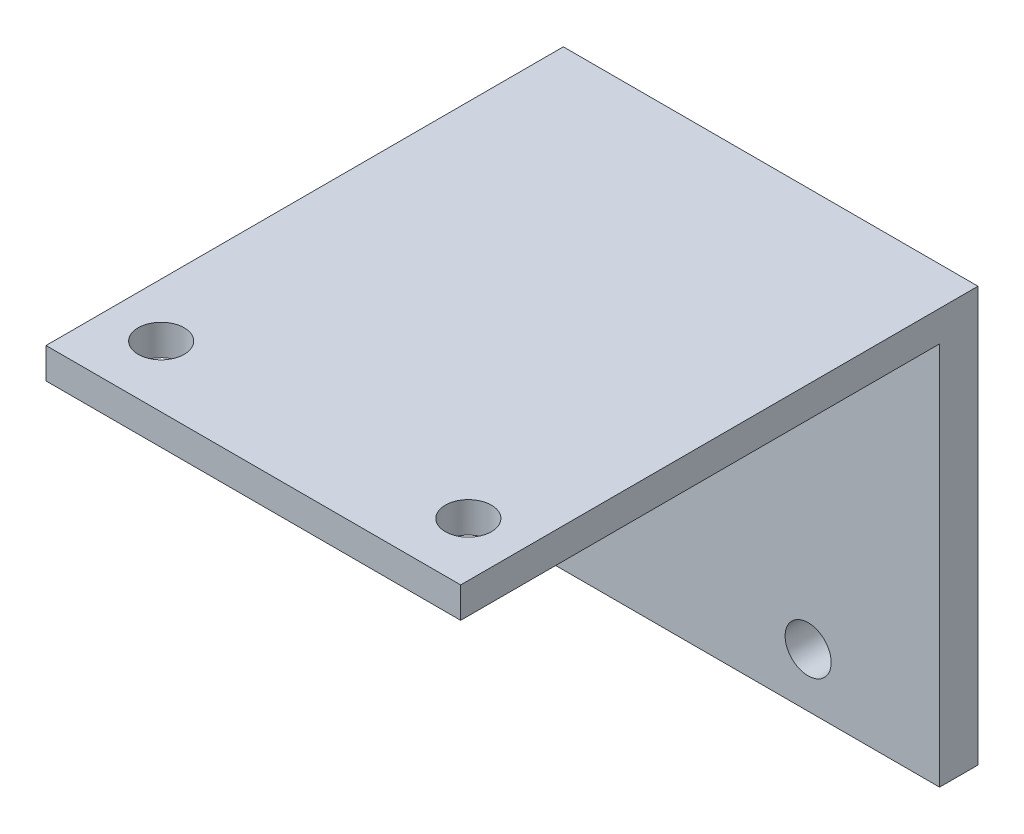
ISO-10303-21;
HEADER;
FILE_DESCRIPTION(('STEP AP214'),'2;1');
FILE_NAME('part.step','',(''),(''),'','','');
FILE_SCHEMA(('AUTOMOTIVE_DESIGN { 1 0 10303 214 1 1 1 1 }'));
ENDSEC;
DATA;
#1=APPLICATION_CONTEXT('core data for automotive mechanical design processes');
#2=APPLICATION_PROTOCOL_DEFINITION('international standard','automotive_design',2000,#1);
#3=PRODUCT_CONTEXT('',#1,'mechanical');
#4=PRODUCT('Part','Part','',(#3));
#5=PRODUCT_RELATED_PRODUCT_CATEGORY('part','',(#4));
#6=PRODUCT_DEFINITION_FORMATION('','',#4);
#7=PRODUCT_DEFINITION_CONTEXT('part definition',#1,'design');
#8=PRODUCT_DEFINITION('design','',#6,#7);
#9=PRODUCT_DEFINITION_SHAPE('','',#8);
#10=(LENGTH_UNIT() NAMED_UNIT(*) SI_UNIT(.MILLI.,.METRE.));
#11=(NAMED_UNIT(*) PLANE_ANGLE_UNIT() SI_UNIT($,.RADIAN.));
#12=(NAMED_UNIT(*) SI_UNIT($,.STERADIAN.) SOLID_ANGLE_UNIT());
#13=UNCERTAINTY_MEASURE_WITH_UNIT(LENGTH_MEASURE(1.E-05),#10,'distance_accuracy_value','');
#14=(GEOMETRIC_REPRESENTATION_CONTEXT(3) GLOBAL_UNCERTAINTY_ASSIGNED_CONTEXT((#13)) GLOBAL_UNIT_ASSIGNED_CONTEXT((#10,
#11,#12)) REPRESENTATION_CONTEXT('',''));
#15=CARTESIAN_POINT('',(0.,0.,0.));
#16=DIRECTION('',(0.,0.,1.));
#17=DIRECTION('',(1.,0.,0.));
#18=AXIS2_PLACEMENT_3D('',#15,#16,#17);
#19=CARTESIAN_POINT('',(0.,-27.,67.37));
#20=DIRECTION('',(0.,1.,0.));
#21=DIRECTION('',(0.,0.,1.));
#22=AXIS2_PLACEMENT_3D('',#19,#20,#21);
#23=PLANE('',#22);
#24=DIRECTION('',(1.,0.,0.));
#25=VECTOR('',#24,1.);
#26=CARTESIAN_POINT('',(0.,-27.,5.));
#27=LINE('',#26,#25);
#28=CARTESIAN_POINT('',(-27.,-27.,5.));
#29=VERTEX_POINT('',#28);
#30=CARTESIAN_POINT('',(27.,-27.,5.));
#31=VERTEX_POINT('',#30);
#32=EDGE_CURVE('E148',#29,#31,#27,.T.);
#33=ORIENTED_EDGE('',*,*,#32,.F.);
#34=DIRECTION('',(0.,0.,-1.));
#35=VECTOR('',#34,1.);
#36=CARTESIAN_POINT('',(-27.,-27.,67.37));
#37=LINE('',#36,#35);
#38=CARTESIAN_POINT('',(-27.,-27.,0.));
#39=VERTEX_POINT('',#38);
#40=EDGE_CURVE('E116',#29,#39,#37,.T.);
#41=ORIENTED_EDGE('',*,*,#40,.T.);
#42=DIRECTION('',(1.,0.,0.));
#43=VECTOR('',#42,1.);
#44=CARTESIAN_POINT('',(0.,-27.,0.));
#45=LINE('',#44,#43);
#46=CARTESIAN_POINT('',(27.,-27.,0.));
#47=VERTEX_POINT('',#46);
#48=EDGE_CURVE('E98',#39,#47,#45,.T.);
#49=ORIENTED_EDGE('',*,*,#48,.T.);
#50=DIRECTION('',(0.,0.,-1.));
#51=VECTOR('',#50,1.);
#52=CARTESIAN_POINT('',(27.,-27.,67.37));
#53=LINE('',#52,#51);
#54=EDGE_CURVE('E87',#31,#47,#53,.T.);
#55=ORIENTED_EDGE('',*,*,#54,.F.);
#56=EDGE_LOOP('',(#33,#41,#49,#55));
#57=FACE_BOUND('',#56,.T.);
#58=ADVANCED_FACE('F34',(#57),#23,.F.);
#59=CARTESIAN_POINT('',(9.88000000000042,-20.,67.37));
#60=DIRECTION('',(0.,0.,-1.));
#61=DIRECTION('',(-1.,0.,0.));
#62=AXIS2_PLACEMENT_3D('',#59,#60,#61);
#63=CYLINDRICAL_SURFACE('',#62,3.);
#64=CARTESIAN_POINT('',(9.88000000000042,-20.,0.));
#65=DIRECTION('',(0.,0.,1.));
#66=DIRECTION('',(1.,0.,0.));
#67=AXIS2_PLACEMENT_3D('',#64,#65,#66);
#68=CIRCLE('',#67,3.);
#69=CARTESIAN_POINT('',(12.8800000000004,-20.,0.));
#70=VERTEX_POINT('',#69);
#71=EDGE_CURVE('E104',#70,#70,#68,.T.);
#72=ORIENTED_EDGE('',*,*,#71,.F.);
#73=EDGE_LOOP('',(#72));
#74=FACE_BOUND('',#73,.T.);
#75=CARTESIAN_POINT('',(9.88000000000042,-20.,5.));
#76=DIRECTION('',(0.,0.,1.));
#77=DIRECTION('',(1.,0.,0.));
#78=AXIS2_PLACEMENT_3D('',#75,#76,#77);
#79=CIRCLE('',#78,3.);
#80=CARTESIAN_POINT('',(12.8800000000004,-20.,5.));
#81=VERTEX_POINT('',#80);
#82=EDGE_CURVE('E141',#81,#81,#79,.T.);
#83=ORIENTED_EDGE('',*,*,#82,.T.);
#84=EDGE_LOOP('',(#83));
#85=FACE_BOUND('',#84,.T.);
#86=ADVANCED_FACE('F36',(#74,#85),#63,.F.);
#87=CARTESIAN_POINT('',(9.88,20.,67.37));
#88=DIRECTION('',(0.,0.,-1.));
#89=DIRECTION('',(-1.,0.,0.));
#90=AXIS2_PLACEMENT_3D('',#87,#88,#89);
#91=CYLINDRICAL_SURFACE('',#90,3.);
#92=CARTESIAN_POINT('',(9.88,20.,0.));
#93=DIRECTION('',(0.,0.,1.));
#94=DIRECTION('',(1.,0.,0.));
#95=AXIS2_PLACEMENT_3D('',#92,#93,#94);
#96=CIRCLE('',#95,3.);
#97=CARTESIAN_POINT('',(12.88,20.,0.));
#98=VERTEX_POINT('',#97);
#99=EDGE_CURVE('E97',#98,#98,#96,.T.);
#100=ORIENTED_EDGE('',*,*,#99,.F.);
#101=EDGE_LOOP('',(#100));
#102=FACE_BOUND('',#101,.T.);
#103=CARTESIAN_POINT('',(9.88,20.,5.));
#104=DIRECTION('',(0.,0.,1.));
#105=DIRECTION('',(1.,0.,0.));
#106=AXIS2_PLACEMENT_3D('',#103,#104,#105);
#107=CIRCLE('',#106,3.);
#108=CARTESIAN_POINT('',(9.88,23.,5.));
#109=VERTEX_POINT('',#108);
#110=EDGE_CURVE('E11',#109,#109,#107,.T.);
#111=ORIENTED_EDGE('',*,*,#110,.T.);
#112=EDGE_LOOP('',(#111));
#113=FACE_BOUND('',#112,.T.);
#114=ADVANCED_FACE('F197',(#102,#113),#91,.F.);
#115=CARTESIAN_POINT('',(0.,27.,67.37));
#116=DIRECTION('',(0.,1.,0.));
#117=DIRECTION('',(0.,0.,1.));
#118=AXIS2_PLACEMENT_3D('',#115,#116,#117);
#119=PLANE('',#118);
#120=CARTESIAN_POINT('',(20.,27.,59.37));
#121=DIRECTION('',(0.,1.,0.));
#122=DIRECTION('',(0.,0.,1.));
#123=AXIS2_PLACEMENT_3D('',#120,#121,#122);
#124=CIRCLE('',#123,3.);
#125=CARTESIAN_POINT('',(20.,27.,62.37));
#126=VERTEX_POINT('',#125);
#127=EDGE_CURVE('E164',#126,#126,#124,.T.);
#128=ORIENTED_EDGE('',*,*,#127,.F.);
#129=EDGE_LOOP('',(#128));
#130=FACE_BOUND('',#129,.T.);
#131=CARTESIAN_POINT('',(-20.,27.,59.37));
#132=DIRECTION('',(0.,1.,0.));
#133=DIRECTION('',(0.,0.,1.));
#134=AXIS2_PLACEMENT_3D('',#131,#132,#133);
#135=CIRCLE('',#134,3.);
#136=CARTESIAN_POINT('',(-20.,27.,62.37));
#137=VERTEX_POINT('',#136);
#138=EDGE_CURVE('E158',#137,#137,#135,.T.);
#139=ORIENTED_EDGE('',*,*,#138,.F.);
#140=EDGE_LOOP('',(#139));
#141=FACE_BOUND('',#140,.T.);
#142=DIRECTION('',(1.,0.,0.));
#143=VECTOR('',#142,1.);
#144=CARTESIAN_POINT('',(0.,27.,0.));
#145=LINE('',#144,#143);
#146=CARTESIAN_POINT('',(-27.,27.,0.));
#147=VERTEX_POINT('',#146);
#148=CARTESIAN_POINT('',(27.,27.,0.));
#149=VERTEX_POINT('',#148);
#150=EDGE_CURVE('E83',#147,#149,#145,.T.);
#151=ORIENTED_EDGE('',*,*,#150,.F.);
#152=DIRECTION('',(0.,0.,-1.));
#153=VECTOR('',#152,1.);
#154=CARTESIAN_POINT('',(-27.,27.,67.37));
#155=LINE('',#154,#153);
#156=CARTESIAN_POINT('',(-27.,27.,67.37));
#157=VERTEX_POINT('',#156);
#158=EDGE_CURVE('E118',#157,#147,#155,.T.);
#159=ORIENTED_EDGE('',*,*,#158,.F.);
#160=DIRECTION('',(1.,0.,0.));
#161=VECTOR('',#160,1.);
#162=CARTESIAN_POINT('',(0.,27.,67.37));
#163=LINE('',#162,#161);
#164=CARTESIAN_POINT('',(27.,27.,67.37));
#165=VERTEX_POINT('',#164);
#166=EDGE_CURVE('E85',#157,#165,#163,.T.);
#167=ORIENTED_EDGE('',*,*,#166,.T.);
#168=DIRECTION('',(0.,0.,-1.));
#169=VECTOR('',#168,1.);
#170=CARTESIAN_POINT('',(27.,27.,67.37));
#171=LINE('',#170,#169);
#172=EDGE_CURVE('E78',#165,#149,#171,.T.);
#173=ORIENTED_EDGE('',*,*,#172,.T.);
#174=EDGE_LOOP('',(#151,#159,#167,#173));
#175=FACE_BOUND('',#174,.T.);
#176=ADVANCED_FACE('F80',(#130,#141,#175),#119,.T.);
#177=CARTESIAN_POINT('',(-27.,0.,67.37));
#178=DIRECTION('',(-1.,0.,0.));
#179=DIRECTION('',(0.,0.,1.));
#180=AXIS2_PLACEMENT_3D('',#177,#178,#179);
#181=PLANE('',#180);
#182=DIRECTION('',(0.,0.,-1.));
#183=VECTOR('',#182,1.);
#184=CARTESIAN_POINT('',(-27.,23.,67.37));
#185=LINE('',#184,#183);
#186=CARTESIAN_POINT('',(-27.,23.,67.37));
#187=VERTEX_POINT('',#186);
#188=CARTESIAN_POINT('',(-27.,23.,5.));
#189=VERTEX_POINT('',#188);
#190=EDGE_CURVE('E127',#187,#189,#185,.T.);
#191=ORIENTED_EDGE('',*,*,#190,.F.);
#192=DIRECTION('',(0.,1.,0.));
#193=VECTOR('',#192,1.);
#194=CARTESIAN_POINT('',(-27.,0.,67.37));
#195=LINE('',#194,#193);
#196=EDGE_CURVE('E138',#187,#157,#195,.T.);
#197=ORIENTED_EDGE('',*,*,#196,.T.);
#198=ORIENTED_EDGE('',*,*,#158,.T.);
#199=DIRECTION('',(0.,1.,0.));
#200=VECTOR('',#199,1.);
#201=CARTESIAN_POINT('',(-27.,0.,0.));
#202=LINE('',#201,#200);
#203=EDGE_CURVE('E103',#39,#147,#202,.T.);
#204=ORIENTED_EDGE('',*,*,#203,.F.);
#205=ORIENTED_EDGE('',*,*,#40,.F.);
#206=DIRECTION('',(0.,1.,0.));
#207=VECTOR('',#206,1.);
#208=CARTESIAN_POINT('',(-27.,0.,5.));
#209=LINE('',#208,#207);
#210=EDGE_CURVE('E108',#29,#189,#209,.T.);
#211=ORIENTED_EDGE('',*,*,#210,.T.);
#212=EDGE_LOOP('',(#191,#197,#198,#204,#205,#211));
#213=FACE_BOUND('',#212,.T.);
#214=ADVANCED_FACE('F137',(#213),#181,.T.);
#215=CARTESIAN_POINT('',(27.,0.,67.37));
#216=DIRECTION('',(-1.,0.,0.));
#217=DIRECTION('',(0.,0.,1.));
#218=AXIS2_PLACEMENT_3D('',#215,#216,#217);
#219=PLANE('',#218);
#220=DIRECTION('',(0.,1.,0.));
#221=VECTOR('',#220,1.);
#222=CARTESIAN_POINT('',(27.,0.,67.37));
#223=LINE('',#222,#221);
#224=CARTESIAN_POINT('',(27.,23.,67.37));
#225=VERTEX_POINT('',#224);
#226=EDGE_CURVE('E58',#225,#165,#223,.T.);
#227=ORIENTED_EDGE('',*,*,#226,.F.);
#228=DIRECTION('',(0.,0.,-1.));
#229=VECTOR('',#228,1.);
#230=CARTESIAN_POINT('',(27.,23.,67.37));
#231=LINE('',#230,#229);
#232=CARTESIAN_POINT('',(27.,23.,5.));
#233=VERTEX_POINT('',#232);
#234=EDGE_CURVE('E131',#225,#233,#231,.T.);
#235=ORIENTED_EDGE('',*,*,#234,.T.);
#236=DIRECTION('',(0.,1.,0.));
#237=VECTOR('',#236,1.);
#238=CARTESIAN_POINT('',(27.,0.,5.));
#239=LINE('',#238,#237);
#240=EDGE_CURVE('E151',#31,#233,#239,.T.);
#241=ORIENTED_EDGE('',*,*,#240,.F.);
#242=ORIENTED_EDGE('',*,*,#54,.T.);
#243=DIRECTION('',(0.,1.,0.));
#244=VECTOR('',#243,1.);
#245=CARTESIAN_POINT('',(27.,0.,0.));
#246=LINE('',#245,#244);
#247=EDGE_CURVE('E90',#47,#149,#246,.T.);
#248=ORIENTED_EDGE('',*,*,#247,.T.);
#249=ORIENTED_EDGE('',*,*,#172,.F.);
#250=EDGE_LOOP('',(#227,#235,#241,#242,#248,#249));
#251=FACE_BOUND('',#250,.T.);
#252=ADVANCED_FACE('F91',(#251),#219,.F.);
#253=CARTESIAN_POINT('',(0.,0.,67.37));
#254=DIRECTION('',(0.,0.,1.));
#255=DIRECTION('',(1.,0.,0.));
#256=AXIS2_PLACEMENT_3D('',#253,#254,#255);
#257=PLANE('',#256);
#258=DIRECTION('',(-1.,0.,0.));
#259=VECTOR('',#258,1.);
#260=CARTESIAN_POINT('',(0.,23.,67.37));
#261=LINE('',#260,#259);
#262=EDGE_CURVE('E42',#225,#187,#261,.T.);
#263=ORIENTED_EDGE('',*,*,#262,.F.);
#264=ORIENTED_EDGE('',*,*,#226,.T.);
#265=ORIENTED_EDGE('',*,*,#166,.F.);
#266=ORIENTED_EDGE('',*,*,#196,.F.);
#267=EDGE_LOOP('',(#263,#264,#265,#266));
#268=FACE_BOUND('',#267,.T.);
#269=ADVANCED_FACE('F143',(#268),#257,.T.);
#270=CARTESIAN_POINT('',(0.,0.,0.));
#271=DIRECTION('',(0.,0.,1.));
#272=DIRECTION('',(1.,0.,0.));
#273=AXIS2_PLACEMENT_3D('',#270,#271,#272);
#274=PLANE('',#273);
#275=ORIENTED_EDGE('',*,*,#71,.T.);
#276=EDGE_LOOP('',(#275));
#277=FACE_BOUND('',#276,.T.);
#278=ORIENTED_EDGE('',*,*,#150,.T.);
#279=ORIENTED_EDGE('',*,*,#247,.F.);
#280=ORIENTED_EDGE('',*,*,#48,.F.);
#281=ORIENTED_EDGE('',*,*,#203,.T.);
#282=EDGE_LOOP('',(#278,#279,#280,#281));
#283=FACE_BOUND('',#282,.T.);
#284=ORIENTED_EDGE('',*,*,#99,.T.);
#285=EDGE_LOOP('',(#284));
#286=FACE_BOUND('',#285,.T.);
#287=ADVANCED_FACE('F100',(#277,#283,#286),#274,.F.);
#288=CARTESIAN_POINT('',(38.7750425347235,23.,5.));
#289=DIRECTION('',(0.,1.,0.));
#290=DIRECTION('',(0.,0.,1.));
#291=AXIS2_PLACEMENT_3D('',#288,#289,#290);
#292=PLANE('',#291);
#293=CARTESIAN_POINT('',(20.,23.,59.37));
#294=DIRECTION('',(0.,-1.,0.));
#295=DIRECTION('',(0.,0.,-1.));
#296=AXIS2_PLACEMENT_3D('',#293,#294,#295);
#297=CIRCLE('',#296,3.);
#298=CARTESIAN_POINT('',(20.,23.,56.37));
#299=VERTEX_POINT('',#298);
#300=EDGE_CURVE('E167',#299,#299,#297,.T.);
#301=ORIENTED_EDGE('',*,*,#300,.F.);
#302=EDGE_LOOP('',(#301));
#303=FACE_BOUND('',#302,.T.);
#304=CARTESIAN_POINT('',(-20.,23.,59.37));
#305=DIRECTION('',(0.,-1.,0.));
#306=DIRECTION('',(0.,0.,-1.));
#307=AXIS2_PLACEMENT_3D('',#304,#305,#306);
#308=CIRCLE('',#307,3.);
#309=CARTESIAN_POINT('',(-20.,23.,56.37));
#310=VERTEX_POINT('',#309);
#311=EDGE_CURVE('E161',#310,#310,#308,.T.);
#312=ORIENTED_EDGE('',*,*,#311,.F.);
#313=EDGE_LOOP('',(#312));
#314=FACE_BOUND('',#313,.T.);
#315=ORIENTED_EDGE('',*,*,#234,.F.);
#316=ORIENTED_EDGE('',*,*,#262,.T.);
#317=ORIENTED_EDGE('',*,*,#190,.T.);
#318=DIRECTION('',(-1.,0.,0.));
#319=VECTOR('',#318,1.);
#320=CARTESIAN_POINT('',(38.7750425347235,23.,5.));
#321=LINE('',#320,#319);
#322=EDGE_CURVE('E156',#109,#189,#321,.T.);
#323=ORIENTED_EDGE('',*,*,#322,.F.);
#324=EDGE_CURVE('E49',#233,#109,#321,.T.);
#325=ORIENTED_EDGE('',*,*,#324,.F.);
#326=EDGE_LOOP('',(#315,#316,#317,#323,#325));
#327=FACE_BOUND('',#326,.T.);
#328=ADVANCED_FACE('F125',(#303,#314,#327),#292,.F.);
#329=CARTESIAN_POINT('',(0.,0.,5.));
#330=DIRECTION('',(0.,0.,1.));
#331=DIRECTION('',(1.,0.,0.));
#332=AXIS2_PLACEMENT_3D('',#329,#330,#331);
#333=PLANE('',#332);
#334=ORIENTED_EDGE('',*,*,#82,.F.);
#335=EDGE_LOOP('',(#334));
#336=FACE_BOUND('',#335,.T.);
#337=ORIENTED_EDGE('',*,*,#32,.T.);
#338=ORIENTED_EDGE('',*,*,#240,.T.);
#339=ORIENTED_EDGE('',*,*,#324,.T.);
#340=ORIENTED_EDGE('',*,*,#110,.F.);
#341=ORIENTED_EDGE('',*,*,#322,.T.);
#342=ORIENTED_EDGE('',*,*,#210,.F.);
#343=EDGE_LOOP('',(#337,#338,#339,#340,#341,#342));
#344=FACE_BOUND('',#343,.T.);
#345=ADVANCED_FACE('F175',(#336,#344),#333,.T.);
#346=CARTESIAN_POINT('',(-20.,85.37,59.37));
#347=DIRECTION('',(0.,-1.,0.));
#348=DIRECTION('',(0.,0.,-1.));
#349=AXIS2_PLACEMENT_3D('',#346,#347,#348);
#350=CYLINDRICAL_SURFACE('',#349,3.);
#351=ORIENTED_EDGE('',*,*,#138,.T.);
#352=EDGE_LOOP('',(#351));
#353=FACE_BOUND('',#352,.T.);
#354=ORIENTED_EDGE('',*,*,#311,.T.);
#355=EDGE_LOOP('',(#354));
#356=FACE_BOUND('',#355,.T.);
#357=ADVANCED_FACE('F179',(#353,#356),#350,.F.);
#358=CARTESIAN_POINT('',(20.,85.37,59.37));
#359=DIRECTION('',(0.,-1.,0.));
#360=DIRECTION('',(0.,0.,-1.));
#361=AXIS2_PLACEMENT_3D('',#358,#359,#360);
#362=CYLINDRICAL_SURFACE('',#361,3.);
#363=ORIENTED_EDGE('',*,*,#127,.T.);
#364=EDGE_LOOP('',(#363));
#365=FACE_BOUND('',#364,.T.);
#366=ORIENTED_EDGE('',*,*,#300,.T.);
#367=EDGE_LOOP('',(#366));
#368=FACE_BOUND('',#367,.T.);
#369=ADVANCED_FACE('F171',(#365,#368),#362,.F.);
#370=CLOSED_SHELL('',(#58,#86,#114,#176,#214,#252,#269,#287,#328,#345,#357,#369));
#371=MANIFOLD_SOLID_BREP('B2',#370);
#372=ADVANCED_BREP_SHAPE_REPRESENTATION('',(#18,#371),#14);
#373=SHAPE_DEFINITION_REPRESENTATION(#9,#372);
ENDSEC;
END-ISO-10303-21;
